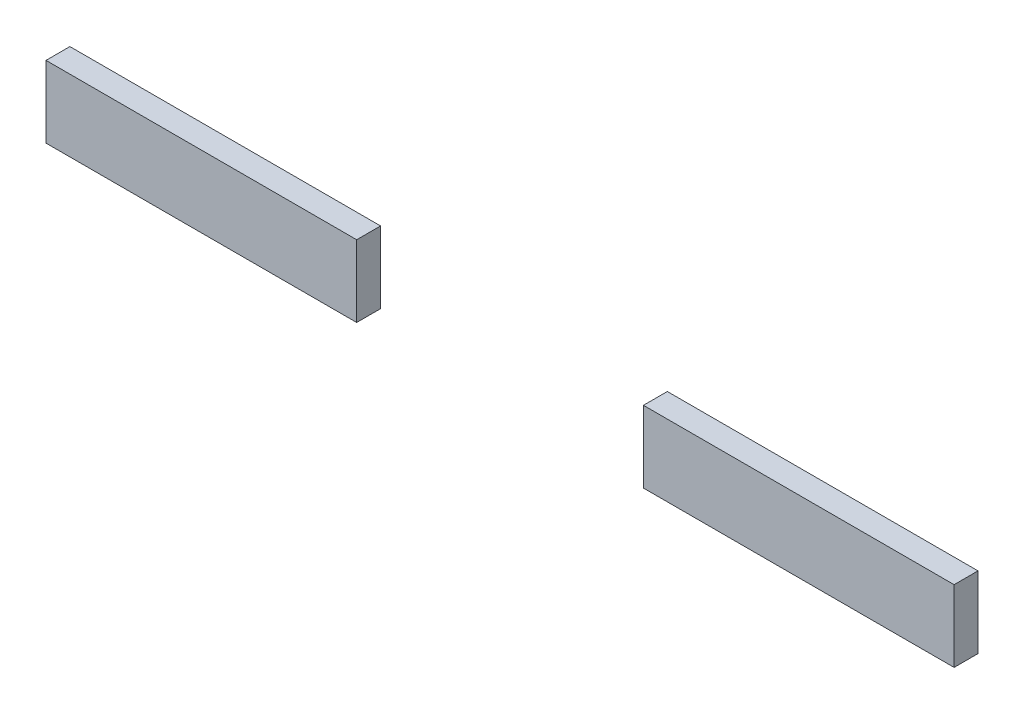
ISO-10303-21;
HEADER;
FILE_DESCRIPTION(('STEP AP214'),'2;1');
FILE_NAME('part.step','',(''),(''),'','','');
FILE_SCHEMA(('AUTOMOTIVE_DESIGN { 1 0 10303 214 1 1 1 1 }'));
ENDSEC;
DATA;
#1=APPLICATION_CONTEXT('core data for automotive mechanical design processes');
#2=APPLICATION_PROTOCOL_DEFINITION('international standard','automotive_design',2000,#1);
#3=PRODUCT_CONTEXT('',#1,'mechanical');
#4=PRODUCT('Part','Part','',(#3));
#5=PRODUCT_RELATED_PRODUCT_CATEGORY('part','',(#4));
#6=PRODUCT_DEFINITION_FORMATION('','',#4);
#7=PRODUCT_DEFINITION_CONTEXT('part definition',#1,'design');
#8=PRODUCT_DEFINITION('design','',#6,#7);
#9=PRODUCT_DEFINITION_SHAPE('','',#8);
#10=(LENGTH_UNIT() NAMED_UNIT(*) SI_UNIT(.MILLI.,.METRE.));
#11=(NAMED_UNIT(*) PLANE_ANGLE_UNIT() SI_UNIT($,.RADIAN.));
#12=(NAMED_UNIT(*) SI_UNIT($,.STERADIAN.) SOLID_ANGLE_UNIT());
#13=UNCERTAINTY_MEASURE_WITH_UNIT(LENGTH_MEASURE(1.E-05),#10,'distance_accuracy_value','');
#14=(GEOMETRIC_REPRESENTATION_CONTEXT(3) GLOBAL_UNCERTAINTY_ASSIGNED_CONTEXT((#13)) GLOBAL_UNIT_ASSIGNED_CONTEXT((#10,
#11,#12)) REPRESENTATION_CONTEXT('',''));
#15=CARTESIAN_POINT('',(0.,0.,0.));
#16=DIRECTION('',(0.,0.,1.));
#17=DIRECTION('',(1.,0.,0.));
#18=AXIS2_PLACEMENT_3D('',#15,#16,#17);
#19=CARTESIAN_POINT('',(4.70000076,0.2999994,0.));
#20=DIRECTION('',(0.,0.,-1.));
#21=DIRECTION('',(-1.,0.,0.));
#22=AXIS2_PLACEMENT_3D('',#19,#20,#21);
#23=PLANE('',#22);
#24=DIRECTION('',(1.,0.,0.));
#25=VECTOR('',#24,1.);
#26=CARTESIAN_POINT('',(7.30000064,0.2999994,0.));
#27=LINE('',#26,#25);
#28=CARTESIAN_POINT('',(4.70000076,0.2999994,0.));
#29=VERTEX_POINT('',#28);
#30=CARTESIAN_POINT('',(7.30000064,0.2999994,0.));
#31=VERTEX_POINT('',#30);
#32=EDGE_CURVE('P0_E58',#29,#31,#27,.T.);
#33=ORIENTED_EDGE('',*,*,#32,.T.);
#34=DIRECTION('',(0.,1.,0.));
#35=VECTOR('',#34,1.);
#36=CARTESIAN_POINT('',(7.30000064,-0.2999994,0.));
#37=LINE('',#36,#35);
#38=CARTESIAN_POINT('',(7.30000064,-0.2999994,0.));
#39=VERTEX_POINT('',#38);
#40=EDGE_CURVE('P0_E53',#31,#39,#37,.F.);
#41=ORIENTED_EDGE('',*,*,#40,.T.);
#42=DIRECTION('',(1.,0.,0.));
#43=VECTOR('',#42,1.);
#44=CARTESIAN_POINT('',(4.70000076,-0.2999994,0.));
#45=LINE('',#44,#43);
#46=CARTESIAN_POINT('',(4.70000076,-0.2999994,0.));
#47=VERTEX_POINT('',#46);
#48=EDGE_CURVE('P0_E68',#39,#47,#45,.F.);
#49=ORIENTED_EDGE('',*,*,#48,.T.);
#50=DIRECTION('',(0.,1.,0.));
#51=VECTOR('',#50,1.);
#52=CARTESIAN_POINT('',(4.70000076,0.2999994,0.));
#53=LINE('',#52,#51);
#54=EDGE_CURVE('P0_E20',#47,#29,#53,.T.);
#55=ORIENTED_EDGE('',*,*,#54,.T.);
#56=EDGE_LOOP('',(#33,#41,#49,#55));
#57=FACE_BOUND('',#56,.T.);
#58=ADVANCED_FACE('P0_F17',(#57),#23,.T.);
#59=CARTESIAN_POINT('',(4.70000076,0.2999994,0.));
#60=DIRECTION('',(1.,0.,0.));
#61=DIRECTION('',(0.,0.,-1.));
#62=AXIS2_PLACEMENT_3D('',#59,#60,#61);
#63=PLANE('',#62);
#64=DIRECTION('',(0.,1.,0.));
#65=VECTOR('',#64,1.);
#66=CARTESIAN_POINT('',(4.70000076,0.2999994,0.1999996));
#67=LINE('',#66,#65);
#68=CARTESIAN_POINT('',(4.70000076,-0.2999994,0.1999996));
#69=VERTEX_POINT('',#68);
#70=CARTESIAN_POINT('',(4.70000076,0.2999994,0.1999996));
#71=VERTEX_POINT('',#70);
#72=EDGE_CURVE('P0_E74',#69,#71,#67,.T.);
#73=ORIENTED_EDGE('',*,*,#72,.T.);
#74=DIRECTION('',(0.,0.,-1.));
#75=VECTOR('',#74,1.);
#76=CARTESIAN_POINT('',(4.70000076,0.2999994,0.));
#77=LINE('',#76,#75);
#78=EDGE_CURVE('P0_E63',#71,#29,#77,.T.);
#79=ORIENTED_EDGE('',*,*,#78,.T.);
#80=ORIENTED_EDGE('',*,*,#54,.F.);
#81=DIRECTION('',(0.,0.,1.));
#82=VECTOR('',#81,1.);
#83=CARTESIAN_POINT('',(4.70000076,-0.2999994,0.));
#84=LINE('',#83,#82);
#85=EDGE_CURVE('P0_E80',#47,#69,#84,.T.);
#86=ORIENTED_EDGE('',*,*,#85,.T.);
#87=EDGE_LOOP('',(#73,#79,#80,#86));
#88=FACE_BOUND('',#87,.T.);
#89=ADVANCED_FACE('P0_F73',(#88),#63,.F.);
#90=CARTESIAN_POINT('',(7.30000064,0.2999994,0.));
#91=DIRECTION('',(0.,-1.,0.));
#92=DIRECTION('',(0.,0.,-1.));
#93=AXIS2_PLACEMENT_3D('',#90,#91,#92);
#94=PLANE('',#93);
#95=DIRECTION('',(-1.,0.,0.));
#96=VECTOR('',#95,1.);
#97=CARTESIAN_POINT('',(4.70000076,0.2999994,0.1999996));
#98=LINE('',#97,#96);
#99=CARTESIAN_POINT('',(7.30000064,0.2999994,0.1999996));
#100=VERTEX_POINT('',#99);
#101=EDGE_CURVE('P0_E84',#71,#100,#98,.F.);
#102=ORIENTED_EDGE('',*,*,#101,.T.);
#103=DIRECTION('',(0.,0.,1.));
#104=VECTOR('',#103,1.);
#105=CARTESIAN_POINT('',(7.30000064,0.2999994,0.));
#106=LINE('',#105,#104);
#107=EDGE_CURVE('P0_E65',#100,#31,#106,.F.);
#108=ORIENTED_EDGE('',*,*,#107,.T.);
#109=ORIENTED_EDGE('',*,*,#32,.F.);
#110=ORIENTED_EDGE('',*,*,#78,.F.);
#111=EDGE_LOOP('',(#102,#108,#109,#110));
#112=FACE_BOUND('',#111,.T.);
#113=ADVANCED_FACE('P0_F61',(#112),#94,.F.);
#114=CARTESIAN_POINT('',(7.30000064,-0.2999994,0.));
#115=DIRECTION('',(-1.,0.,0.));
#116=DIRECTION('',(0.,0.,1.));
#117=AXIS2_PLACEMENT_3D('',#114,#115,#116);
#118=PLANE('',#117);
#119=DIRECTION('',(0.,1.,0.));
#120=VECTOR('',#119,1.);
#121=CARTESIAN_POINT('',(7.30000064,0.2999994,0.1999996));
#122=LINE('',#121,#120);
#123=CARTESIAN_POINT('',(7.30000064,-0.2999994,0.1999996));
#124=VERTEX_POINT('',#123);
#125=EDGE_CURVE('P0_E26',#100,#124,#122,.F.);
#126=ORIENTED_EDGE('',*,*,#125,.T.);
#127=DIRECTION('',(0.,0.,1.));
#128=VECTOR('',#127,1.);
#129=CARTESIAN_POINT('',(7.30000064,-0.2999994,0.));
#130=LINE('',#129,#128);
#131=EDGE_CURVE('P0_E34',#124,#39,#130,.F.);
#132=ORIENTED_EDGE('',*,*,#131,.T.);
#133=ORIENTED_EDGE('',*,*,#40,.F.);
#134=ORIENTED_EDGE('',*,*,#107,.F.);
#135=EDGE_LOOP('',(#126,#132,#133,#134));
#136=FACE_BOUND('',#135,.T.);
#137=ADVANCED_FACE('P0_F88',(#136),#118,.F.);
#138=CARTESIAN_POINT('',(4.70000076,-0.2999994,0.));
#139=DIRECTION('',(0.,1.,0.));
#140=DIRECTION('',(0.,0.,1.));
#141=AXIS2_PLACEMENT_3D('',#138,#139,#140);
#142=PLANE('',#141);
#143=DIRECTION('',(-1.,0.,0.));
#144=VECTOR('',#143,1.);
#145=CARTESIAN_POINT('',(4.70000076,-0.2999994,0.1999996));
#146=LINE('',#145,#144);
#147=EDGE_CURVE('P0_E11',#124,#69,#146,.T.);
#148=ORIENTED_EDGE('',*,*,#147,.T.);
#149=ORIENTED_EDGE('',*,*,#85,.F.);
#150=ORIENTED_EDGE('',*,*,#48,.F.);
#151=ORIENTED_EDGE('',*,*,#131,.F.);
#152=EDGE_LOOP('',(#148,#149,#150,#151));
#153=FACE_BOUND('',#152,.T.);
#154=ADVANCED_FACE('P0_F91',(#153),#142,.F.);
#155=CARTESIAN_POINT('',(4.70000076,0.2999994,0.1999996));
#156=DIRECTION('',(0.,0.,-1.));
#157=DIRECTION('',(-1.,0.,0.));
#158=AXIS2_PLACEMENT_3D('',#155,#156,#157);
#159=PLANE('',#158);
#160=ORIENTED_EDGE('',*,*,#125,.F.);
#161=ORIENTED_EDGE('',*,*,#101,.F.);
#162=ORIENTED_EDGE('',*,*,#72,.F.);
#163=ORIENTED_EDGE('',*,*,#147,.F.);
#164=EDGE_LOOP('',(#160,#161,#162,#163));
#165=FACE_BOUND('',#164,.T.);
#166=ADVANCED_FACE('P0_F90',(#165),#159,.F.);
#167=CLOSED_SHELL('',(#58,#89,#113,#137,#154,#166));
#168=MANIFOLD_SOLID_BREP('P0_B1',#167);
#169=CARTESIAN_POINT('',(-0.2999994,0.2999994,0.));
#170=DIRECTION('',(0.,0.,-1.));
#171=DIRECTION('',(-1.,0.,0.));
#172=AXIS2_PLACEMENT_3D('',#169,#170,#171);
#173=PLANE('',#172);
#174=DIRECTION('',(1.,0.,0.));
#175=VECTOR('',#174,1.);
#176=CARTESIAN_POINT('',(2.30000048,0.2999994,0.));
#177=LINE('',#176,#175);
#178=CARTESIAN_POINT('',(-0.2999994,0.2999994,0.));
#179=VERTEX_POINT('',#178);
#180=CARTESIAN_POINT('',(2.30000048,0.2999994,0.));
#181=VERTEX_POINT('',#180);
#182=EDGE_CURVE('P1_E58',#179,#181,#177,.T.);
#183=ORIENTED_EDGE('',*,*,#182,.T.);
#184=DIRECTION('',(0.,1.,0.));
#185=VECTOR('',#184,1.);
#186=CARTESIAN_POINT('',(2.30000048,-0.2999994,0.));
#187=LINE('',#186,#185);
#188=CARTESIAN_POINT('',(2.30000048,-0.2999994,0.));
#189=VERTEX_POINT('',#188);
#190=EDGE_CURVE('P1_E53',#181,#189,#187,.F.);
#191=ORIENTED_EDGE('',*,*,#190,.T.);
#192=DIRECTION('',(1.,0.,0.));
#193=VECTOR('',#192,1.);
#194=CARTESIAN_POINT('',(-0.2999994,-0.2999994,0.));
#195=LINE('',#194,#193);
#196=CARTESIAN_POINT('',(-0.2999994,-0.2999994,0.));
#197=VERTEX_POINT('',#196);
#198=EDGE_CURVE('P1_E68',#189,#197,#195,.F.);
#199=ORIENTED_EDGE('',*,*,#198,.T.);
#200=DIRECTION('',(0.,1.,0.));
#201=VECTOR('',#200,1.);
#202=CARTESIAN_POINT('',(-0.2999994,0.2999994,0.));
#203=LINE('',#202,#201);
#204=EDGE_CURVE('P1_E20',#197,#179,#203,.T.);
#205=ORIENTED_EDGE('',*,*,#204,.T.);
#206=EDGE_LOOP('',(#183,#191,#199,#205));
#207=FACE_BOUND('',#206,.T.);
#208=ADVANCED_FACE('P1_F17',(#207),#173,.T.);
#209=CARTESIAN_POINT('',(-0.2999994,0.2999994,0.));
#210=DIRECTION('',(1.,0.,0.));
#211=DIRECTION('',(0.,0.,-1.));
#212=AXIS2_PLACEMENT_3D('',#209,#210,#211);
#213=PLANE('',#212);
#214=DIRECTION('',(0.,1.,0.));
#215=VECTOR('',#214,1.);
#216=CARTESIAN_POINT('',(-0.2999994,0.2999994,0.1999996));
#217=LINE('',#216,#215);
#218=CARTESIAN_POINT('',(-0.2999994,-0.2999994,0.1999996));
#219=VERTEX_POINT('',#218);
#220=CARTESIAN_POINT('',(-0.2999994,0.2999994,0.1999996));
#221=VERTEX_POINT('',#220);
#222=EDGE_CURVE('P1_E74',#219,#221,#217,.T.);
#223=ORIENTED_EDGE('',*,*,#222,.T.);
#224=DIRECTION('',(0.,0.,-1.));
#225=VECTOR('',#224,1.);
#226=CARTESIAN_POINT('',(-0.2999994,0.2999994,0.));
#227=LINE('',#226,#225);
#228=EDGE_CURVE('P1_E63',#221,#179,#227,.T.);
#229=ORIENTED_EDGE('',*,*,#228,.T.);
#230=ORIENTED_EDGE('',*,*,#204,.F.);
#231=DIRECTION('',(0.,0.,1.));
#232=VECTOR('',#231,1.);
#233=CARTESIAN_POINT('',(-0.2999994,-0.2999994,0.));
#234=LINE('',#233,#232);
#235=EDGE_CURVE('P1_E80',#197,#219,#234,.T.);
#236=ORIENTED_EDGE('',*,*,#235,.T.);
#237=EDGE_LOOP('',(#223,#229,#230,#236));
#238=FACE_BOUND('',#237,.T.);
#239=ADVANCED_FACE('P1_F73',(#238),#213,.F.);
#240=CARTESIAN_POINT('',(2.30000048,0.2999994,0.));
#241=DIRECTION('',(0.,-1.,0.));
#242=DIRECTION('',(0.,0.,-1.));
#243=AXIS2_PLACEMENT_3D('',#240,#241,#242);
#244=PLANE('',#243);
#245=DIRECTION('',(-1.,0.,0.));
#246=VECTOR('',#245,1.);
#247=CARTESIAN_POINT('',(-0.2999994,0.2999994,0.1999996));
#248=LINE('',#247,#246);
#249=CARTESIAN_POINT('',(2.30000048,0.2999994,0.1999996));
#250=VERTEX_POINT('',#249);
#251=EDGE_CURVE('P1_E84',#221,#250,#248,.F.);
#252=ORIENTED_EDGE('',*,*,#251,.T.);
#253=DIRECTION('',(0.,0.,1.));
#254=VECTOR('',#253,1.);
#255=CARTESIAN_POINT('',(2.30000048,0.2999994,0.));
#256=LINE('',#255,#254);
#257=EDGE_CURVE('P1_E65',#250,#181,#256,.F.);
#258=ORIENTED_EDGE('',*,*,#257,.T.);
#259=ORIENTED_EDGE('',*,*,#182,.F.);
#260=ORIENTED_EDGE('',*,*,#228,.F.);
#261=EDGE_LOOP('',(#252,#258,#259,#260));
#262=FACE_BOUND('',#261,.T.);
#263=ADVANCED_FACE('P1_F61',(#262),#244,.F.);
#264=CARTESIAN_POINT('',(2.30000048,-0.2999994,0.));
#265=DIRECTION('',(-1.,0.,0.));
#266=DIRECTION('',(0.,0.,1.));
#267=AXIS2_PLACEMENT_3D('',#264,#265,#266);
#268=PLANE('',#267);
#269=DIRECTION('',(0.,1.,0.));
#270=VECTOR('',#269,1.);
#271=CARTESIAN_POINT('',(2.30000048,0.2999994,0.1999996));
#272=LINE('',#271,#270);
#273=CARTESIAN_POINT('',(2.30000048,-0.2999994,0.1999996));
#274=VERTEX_POINT('',#273);
#275=EDGE_CURVE('P1_E26',#250,#274,#272,.F.);
#276=ORIENTED_EDGE('',*,*,#275,.T.);
#277=DIRECTION('',(0.,0.,1.));
#278=VECTOR('',#277,1.);
#279=CARTESIAN_POINT('',(2.30000048,-0.2999994,0.));
#280=LINE('',#279,#278);
#281=EDGE_CURVE('P1_E34',#274,#189,#280,.F.);
#282=ORIENTED_EDGE('',*,*,#281,.T.);
#283=ORIENTED_EDGE('',*,*,#190,.F.);
#284=ORIENTED_EDGE('',*,*,#257,.F.);
#285=EDGE_LOOP('',(#276,#282,#283,#284));
#286=FACE_BOUND('',#285,.T.);
#287=ADVANCED_FACE('P1_F88',(#286),#268,.F.);
#288=CARTESIAN_POINT('',(-0.2999994,-0.2999994,0.));
#289=DIRECTION('',(0.,1.,0.));
#290=DIRECTION('',(0.,0.,1.));
#291=AXIS2_PLACEMENT_3D('',#288,#289,#290);
#292=PLANE('',#291);
#293=DIRECTION('',(-1.,0.,0.));
#294=VECTOR('',#293,1.);
#295=CARTESIAN_POINT('',(-0.2999994,-0.2999994,0.1999996));
#296=LINE('',#295,#294);
#297=EDGE_CURVE('P1_E11',#274,#219,#296,.T.);
#298=ORIENTED_EDGE('',*,*,#297,.T.);
#299=ORIENTED_EDGE('',*,*,#235,.F.);
#300=ORIENTED_EDGE('',*,*,#198,.F.);
#301=ORIENTED_EDGE('',*,*,#281,.F.);
#302=EDGE_LOOP('',(#298,#299,#300,#301));
#303=FACE_BOUND('',#302,.T.);
#304=ADVANCED_FACE('P1_F91',(#303),#292,.F.);
#305=CARTESIAN_POINT('',(-0.2999994,0.2999994,0.1999996));
#306=DIRECTION('',(0.,0.,-1.));
#307=DIRECTION('',(-1.,0.,0.));
#308=AXIS2_PLACEMENT_3D('',#305,#306,#307);
#309=PLANE('',#308);
#310=ORIENTED_EDGE('',*,*,#275,.F.);
#311=ORIENTED_EDGE('',*,*,#251,.F.);
#312=ORIENTED_EDGE('',*,*,#222,.F.);
#313=ORIENTED_EDGE('',*,*,#297,.F.);
#314=EDGE_LOOP('',(#310,#311,#312,#313));
#315=FACE_BOUND('',#314,.T.);
#316=ADVANCED_FACE('P1_F90',(#315),#309,.F.);
#317=CLOSED_SHELL('',(#208,#239,#263,#287,#304,#316));
#318=MANIFOLD_SOLID_BREP('P1_B1',#317);
#319=ADVANCED_BREP_SHAPE_REPRESENTATION('',(#18,#168,#318),#14);
#320=SHAPE_DEFINITION_REPRESENTATION(#9,#319);
ENDSEC;
END-ISO-10303-21;
